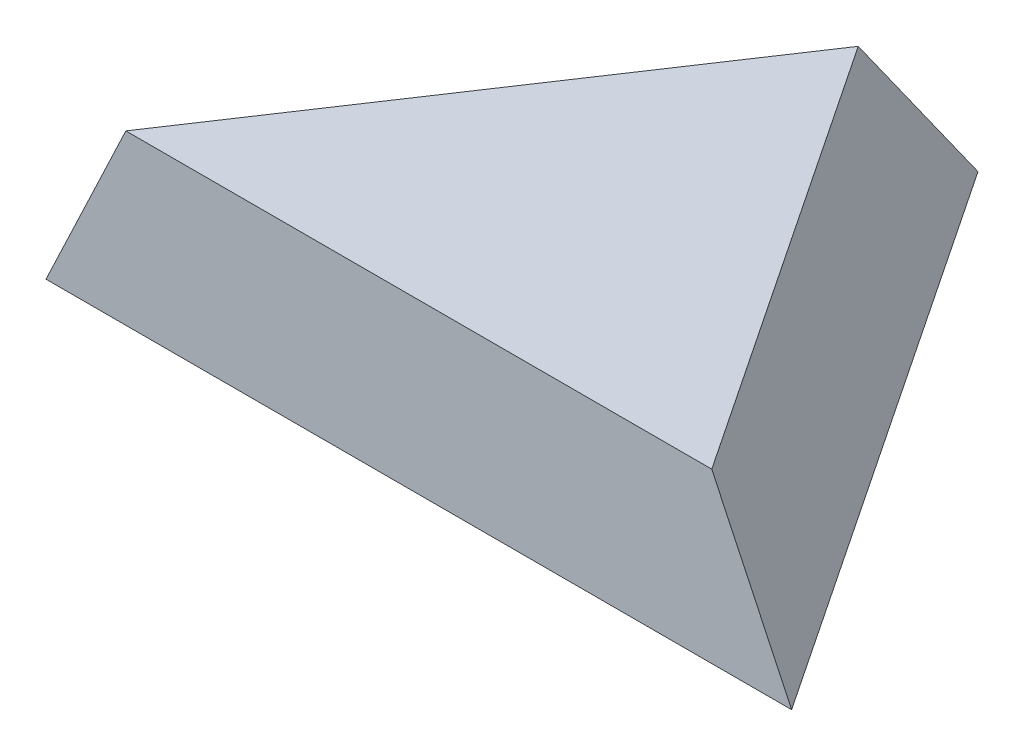
ISO-10303-21;
HEADER;
FILE_DESCRIPTION(('STEP AP214'),'2;1');
FILE_NAME('part.step','',(''),(''),'','','');
FILE_SCHEMA(('AUTOMOTIVE_DESIGN { 1 0 10303 214 1 1 1 1 }'));
ENDSEC;
DATA;
#1=APPLICATION_CONTEXT('core data for automotive mechanical design processes');
#2=APPLICATION_PROTOCOL_DEFINITION('international standard','automotive_design',2000,#1);
#3=PRODUCT_CONTEXT('',#1,'mechanical');
#4=PRODUCT('Part','Part','',(#3));
#5=PRODUCT_RELATED_PRODUCT_CATEGORY('part','',(#4));
#6=PRODUCT_DEFINITION_FORMATION('','',#4);
#7=PRODUCT_DEFINITION_CONTEXT('part definition',#1,'design');
#8=PRODUCT_DEFINITION('design','',#6,#7);
#9=PRODUCT_DEFINITION_SHAPE('','',#8);
#10=(LENGTH_UNIT() NAMED_UNIT(*) SI_UNIT(.MILLI.,.METRE.));
#11=(NAMED_UNIT(*) PLANE_ANGLE_UNIT() SI_UNIT($,.RADIAN.));
#12=(NAMED_UNIT(*) SI_UNIT($,.STERADIAN.) SOLID_ANGLE_UNIT());
#13=UNCERTAINTY_MEASURE_WITH_UNIT(LENGTH_MEASURE(1.E-05),#10,'distance_accuracy_value','');
#14=(GEOMETRIC_REPRESENTATION_CONTEXT(3) GLOBAL_UNCERTAINTY_ASSIGNED_CONTEXT((#13)) GLOBAL_UNIT_ASSIGNED_CONTEXT((#10,
#11,#12)) REPRESENTATION_CONTEXT('',''));
#15=CARTESIAN_POINT('',(0.,0.,0.));
#16=DIRECTION('',(0.,0.,1.));
#17=DIRECTION('',(1.,0.,0.));
#18=AXIS2_PLACEMENT_3D('',#15,#16,#17);
#19=CARTESIAN_POINT('',(0.,137.668,0.));
#20=DIRECTION('',(0.,1.,0.));
#21=DIRECTION('',(0.,0.,1.));
#22=AXIS2_PLACEMENT_3D('',#19,#20,#21);
#23=PLANE('',#22);
#24=DIRECTION('',(-0.554700196225229,0.,-0.832050294337844));
#25=VECTOR('',#24,1.);
#26=CARTESIAN_POINT('',(0.,137.668,97.9206829049191));
#27=LINE('',#26,#25);
#28=CARTESIAN_POINT('',(239.519544730054,137.668,457.2));
#29=VERTEX_POINT('',#28);
#30=CARTESIAN_POINT('',(0.,137.668,97.9206829049191));
#31=VERTEX_POINT('',#30);
#32=EDGE_CURVE('E105',#29,#31,#27,.T.);
#33=ORIENTED_EDGE('',*,*,#32,.T.);
#34=DIRECTION('',(-0.554700196225229,0.,0.832050294337844));
#35=VECTOR('',#34,1.);
#36=CARTESIAN_POINT('',(-239.519544730054,137.668,457.2));
#37=LINE('',#36,#35);
#38=CARTESIAN_POINT('',(-239.519544730054,137.668,457.2));
#39=VERTEX_POINT('',#38);
#40=EDGE_CURVE('E12',#31,#39,#37,.T.);
#41=ORIENTED_EDGE('',*,*,#40,.T.);
#42=DIRECTION('',(1.,0.,0.));
#43=VECTOR('',#42,1.);
#44=CARTESIAN_POINT('',(239.519544730054,137.668,457.2));
#45=LINE('',#44,#43);
#46=EDGE_CURVE('E52',#39,#29,#45,.T.);
#47=ORIENTED_EDGE('',*,*,#46,.T.);
#48=EDGE_LOOP('',(#33,#41,#47));
#49=FACE_BOUND('',#48,.T.);
#50=ADVANCED_FACE('F42',(#49),#23,.T.);
#51=CARTESIAN_POINT('',(0.,0.,0.));
#52=DIRECTION('',(0.,1.,0.));
#53=DIRECTION('',(0.,0.,1.));
#54=AXIS2_PLACEMENT_3D('',#51,#52,#53);
#55=PLANE('',#54);
#56=DIRECTION('',(-0.554700196225229,0.,-0.832050294337844));
#57=VECTOR('',#56,1.);
#58=CARTESIAN_POINT('',(304.8,0.,457.2));
#59=LINE('',#58,#57);
#60=CARTESIAN_POINT('',(304.8,0.,457.2));
#61=VERTEX_POINT('',#60);
#62=CARTESIAN_POINT('',(0.,0.,0.));
#63=VERTEX_POINT('',#62);
#64=EDGE_CURVE('E84',#61,#63,#59,.T.);
#65=ORIENTED_EDGE('',*,*,#64,.F.);
#66=DIRECTION('',(1.,0.,0.));
#67=VECTOR('',#66,1.);
#68=CARTESIAN_POINT('',(-304.8,0.,457.2));
#69=LINE('',#68,#67);
#70=CARTESIAN_POINT('',(-304.8,0.,457.2));
#71=VERTEX_POINT('',#70);
#72=EDGE_CURVE('E87',#71,#61,#69,.T.);
#73=ORIENTED_EDGE('',*,*,#72,.F.);
#74=DIRECTION('',(-0.554700196225229,0.,0.832050294337844));
#75=VECTOR('',#74,1.);
#76=CARTESIAN_POINT('',(0.,0.,0.));
#77=LINE('',#76,#75);
#78=EDGE_CURVE('E81',#63,#71,#77,.T.);
#79=ORIENTED_EDGE('',*,*,#78,.F.);
#80=EDGE_LOOP('',(#65,#73,#79));
#81=FACE_BOUND('',#80,.T.);
#82=ADVANCED_FACE('F83',(#81),#55,.F.);
#83=CARTESIAN_POINT('',(0.,-1.84354376782775E-13,457.2));
#84=DIRECTION('',(0.,0.,-1.));
#85=DIRECTION('',(0.,1.,0.));
#86=AXIS2_PLACEMENT_3D('',#83,#84,#85);
#87=PLANE('',#86);
#88=DIRECTION('',(-0.428457780997527,0.903561801927613,0.));
#89=VECTOR('',#88,1.);
#90=CARTESIAN_POINT('',(304.8,0.,457.2));
#91=LINE('',#90,#89);
#92=EDGE_CURVE('E99',#61,#29,#91,.T.);
#93=ORIENTED_EDGE('',*,*,#92,.T.);
#94=ORIENTED_EDGE('',*,*,#46,.F.);
#95=DIRECTION('',(0.428457780997527,0.903561801927613,0.));
#96=VECTOR('',#95,1.);
#97=CARTESIAN_POINT('',(-304.8,0.,457.2));
#98=LINE('',#97,#96);
#99=EDGE_CURVE('E106',#71,#39,#98,.T.);
#100=ORIENTED_EDGE('',*,*,#99,.F.);
#101=ORIENTED_EDGE('',*,*,#72,.T.);
#102=EDGE_LOOP('',(#93,#94,#100,#101));
#103=FACE_BOUND('',#102,.T.);
#104=ADVANCED_FACE('F127',(#103),#87,.F.);
#105=CARTESIAN_POINT('',(-1.28894537657863E-13,0.,0.));
#106=DIRECTION('',(0.773985855688059,-0.367014477088469,0.515990570458706));
#107=DIRECTION('',(0.554700196225229,0.,-0.832050294337844));
#108=AXIS2_PLACEMENT_3D('',#105,#106,#107);
#109=PLANE('',#108);
#110=ORIENTED_EDGE('',*,*,#99,.T.);
#111=ORIENTED_EDGE('',*,*,#40,.F.);
#112=DIRECTION('',(0.,0.814889795416333,0.579615925701086));
#113=VECTOR('',#112,1.);
#114=CARTESIAN_POINT('',(0.,0.,0.));
#115=LINE('',#114,#113);
#116=EDGE_CURVE('E60',#63,#31,#115,.T.);
#117=ORIENTED_EDGE('',*,*,#116,.F.);
#118=ORIENTED_EDGE('',*,*,#78,.T.);
#119=EDGE_LOOP('',(#110,#111,#117,#118));
#120=FACE_BOUND('',#119,.T.);
#121=ADVANCED_FACE('F103',(#120),#109,.F.);
#122=CARTESIAN_POINT('',(0.,0.,0.));
#123=DIRECTION('',(-0.773985855688059,-0.367014477088469,0.515990570458706));
#124=DIRECTION('',(0.554700196225229,0.,0.832050294337844));
#125=AXIS2_PLACEMENT_3D('',#122,#123,#124);
#126=PLANE('',#125);
#127=ORIENTED_EDGE('',*,*,#116,.T.);
#128=ORIENTED_EDGE('',*,*,#32,.F.);
#129=ORIENTED_EDGE('',*,*,#92,.F.);
#130=ORIENTED_EDGE('',*,*,#64,.T.);
#131=EDGE_LOOP('',(#127,#128,#129,#130));
#132=FACE_BOUND('',#131,.T.);
#133=ADVANCED_FACE('F97',(#132),#126,.F.);
#134=CLOSED_SHELL('',(#50,#82,#104,#121,#133));
#135=MANIFOLD_SOLID_BREP('B2',#134);
#136=ADVANCED_BREP_SHAPE_REPRESENTATION('',(#18,#135),#14);
#137=SHAPE_DEFINITION_REPRESENTATION(#9,#136);
ENDSEC;
END-ISO-10303-21;
